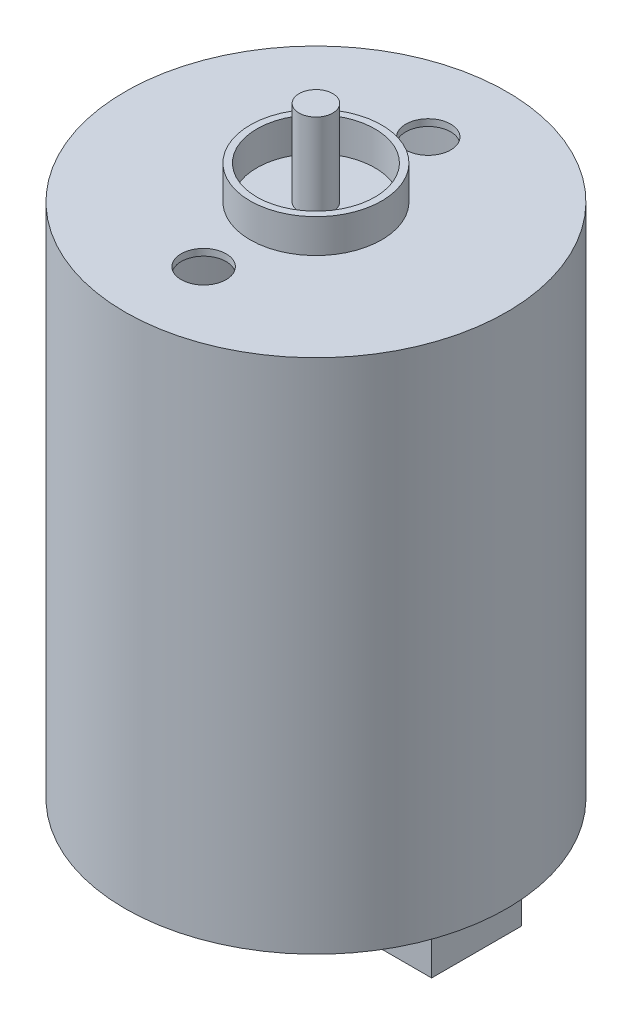
ISO-10303-21;
HEADER;
FILE_DESCRIPTION(('STEP AP214'),'2;1');
FILE_NAME('part.step','',(''),(''),'','','');
FILE_SCHEMA(('AUTOMOTIVE_DESIGN { 1 0 10303 214 1 1 1 1 }'));
ENDSEC;
DATA;
#1=APPLICATION_CONTEXT('core data for automotive mechanical design processes');
#2=APPLICATION_PROTOCOL_DEFINITION('international standard','automotive_design',2000,#1);
#3=PRODUCT_CONTEXT('',#1,'mechanical');
#4=PRODUCT('Part','Part','',(#3));
#5=PRODUCT_RELATED_PRODUCT_CATEGORY('part','',(#4));
#6=PRODUCT_DEFINITION_FORMATION('','',#4);
#7=PRODUCT_DEFINITION_CONTEXT('part definition',#1,'design');
#8=PRODUCT_DEFINITION('design','',#6,#7);
#9=PRODUCT_DEFINITION_SHAPE('','',#8);
#10=(LENGTH_UNIT() NAMED_UNIT(*) SI_UNIT(.MILLI.,.METRE.));
#11=(NAMED_UNIT(*) PLANE_ANGLE_UNIT() SI_UNIT($,.RADIAN.));
#12=(NAMED_UNIT(*) SI_UNIT($,.STERADIAN.) SOLID_ANGLE_UNIT());
#13=UNCERTAINTY_MEASURE_WITH_UNIT(LENGTH_MEASURE(1.E-05),#10,'distance_accuracy_value','');
#14=(GEOMETRIC_REPRESENTATION_CONTEXT(3) GLOBAL_UNCERTAINTY_ASSIGNED_CONTEXT((#13)) GLOBAL_UNIT_ASSIGNED_CONTEXT((#10,
#11,#12)) REPRESENTATION_CONTEXT('',''));
#15=CARTESIAN_POINT('',(0.,0.,0.));
#16=DIRECTION('',(0.,0.,1.));
#17=DIRECTION('',(1.,0.,0.));
#18=AXIS2_PLACEMENT_3D('',#15,#16,#17);
#19=CARTESIAN_POINT('',(0.,0.5,0.));
#20=DIRECTION('',(0.,-1.,0.));
#21=DIRECTION('',(0.,0.,-1.));
#22=AXIS2_PLACEMENT_3D('',#19,#20,#21);
#23=PLANE('',#22);
#24=CARTESIAN_POINT('',(0.,0.5,0.));
#25=DIRECTION('',(0.,-1.,0.));
#26=DIRECTION('',(0.,0.,-1.));
#27=AXIS2_PLACEMENT_3D('',#24,#25,#26);
#28=CIRCLE('',#27,1.15);
#29=CARTESIAN_POINT('',(0.,0.5,-1.15));
#30=VERTEX_POINT('',#29);
#31=EDGE_CURVE('E181',#30,#30,#28,.T.);
#32=ORIENTED_EDGE('',*,*,#31,.F.);
#33=EDGE_LOOP('',(#32));
#34=FACE_BOUND('',#33,.T.);
#35=CARTESIAN_POINT('',(0.,0.5,0.));
#36=DIRECTION('',(0.,-1.,0.));
#37=DIRECTION('',(0.,0.,-1.));
#38=AXIS2_PLACEMENT_3D('',#35,#36,#37);
#39=CIRCLE('',#38,8.2);
#40=CARTESIAN_POINT('',(0.,0.5,-8.2));
#41=VERTEX_POINT('',#40);
#42=EDGE_CURVE('E42',#41,#41,#39,.T.);
#43=ORIENTED_EDGE('',*,*,#42,.T.);
#44=EDGE_LOOP('',(#43));
#45=FACE_BOUND('',#44,.T.);
#46=DIRECTION('',(-1.,0.,0.));
#47=VECTOR('',#46,1.);
#48=CARTESIAN_POINT('',(-7.15,0.5,2.));
#49=LINE('',#48,#47);
#50=CARTESIAN_POINT('',(-4.85,0.5,2.));
#51=VERTEX_POINT('',#50);
#52=CARTESIAN_POINT('',(-7.15,0.5,2.));
#53=VERTEX_POINT('',#52);
#54=EDGE_CURVE('E128',#51,#53,#49,.T.);
#55=ORIENTED_EDGE('',*,*,#54,.F.);
#56=DIRECTION('',(0.,0.,1.));
#57=VECTOR('',#56,1.);
#58=CARTESIAN_POINT('',(-4.85,0.5,2.));
#59=LINE('',#58,#57);
#60=CARTESIAN_POINT('',(-4.85,0.5,-2.));
#61=VERTEX_POINT('',#60);
#62=EDGE_CURVE('E125',#61,#51,#59,.T.);
#63=ORIENTED_EDGE('',*,*,#62,.F.);
#64=DIRECTION('',(1.,0.,0.));
#65=VECTOR('',#64,1.);
#66=CARTESIAN_POINT('',(-7.15,0.5,-2.));
#67=LINE('',#66,#65);
#68=CARTESIAN_POINT('',(-7.15,0.5,-2.));
#69=VERTEX_POINT('',#68);
#70=EDGE_CURVE('E137',#69,#61,#67,.T.);
#71=ORIENTED_EDGE('',*,*,#70,.F.);
#72=DIRECTION('',(0.,0.,-1.));
#73=VECTOR('',#72,1.);
#74=CARTESIAN_POINT('',(-7.15,0.5,2.));
#75=LINE('',#74,#73);
#76=EDGE_CURVE('E145',#53,#69,#75,.T.);
#77=ORIENTED_EDGE('',*,*,#76,.F.);
#78=EDGE_LOOP('',(#55,#63,#71,#77));
#79=FACE_BOUND('',#78,.T.);
#80=DIRECTION('',(-1.,0.,0.));
#81=VECTOR('',#80,1.);
#82=CARTESIAN_POINT('',(4.85,0.5,2.));
#83=LINE('',#82,#81);
#84=CARTESIAN_POINT('',(7.15,0.5,2.));
#85=VERTEX_POINT('',#84);
#86=CARTESIAN_POINT('',(4.85,0.5,2.));
#87=VERTEX_POINT('',#86);
#88=EDGE_CURVE('E463',#85,#87,#83,.T.);
#89=ORIENTED_EDGE('',*,*,#88,.F.);
#90=DIRECTION('',(0.,0.,1.));
#91=VECTOR('',#90,1.);
#92=CARTESIAN_POINT('',(7.15,0.5,2.));
#93=LINE('',#92,#91);
#94=CARTESIAN_POINT('',(7.15,0.5,-2.));
#95=VERTEX_POINT('',#94);
#96=EDGE_CURVE('E123',#95,#85,#93,.T.);
#97=ORIENTED_EDGE('',*,*,#96,.F.);
#98=DIRECTION('',(1.,0.,0.));
#99=VECTOR('',#98,1.);
#100=CARTESIAN_POINT('',(4.85,0.5,-2.));
#101=LINE('',#100,#99);
#102=CARTESIAN_POINT('',(4.85,0.5,-2.));
#103=VERTEX_POINT('',#102);
#104=EDGE_CURVE('E119',#103,#95,#101,.T.);
#105=ORIENTED_EDGE('',*,*,#104,.F.);
#106=DIRECTION('',(0.,0.,-1.));
#107=VECTOR('',#106,1.);
#108=CARTESIAN_POINT('',(4.85,0.5,2.));
#109=LINE('',#108,#107);
#110=EDGE_CURVE('E460',#87,#103,#109,.T.);
#111=ORIENTED_EDGE('',*,*,#110,.F.);
#112=EDGE_LOOP('',(#89,#97,#105,#111));
#113=FACE_BOUND('',#112,.T.);
#114=ADVANCED_FACE('F34',(#34,#45,#79,#113),#23,.T.);
#115=CARTESIAN_POINT('',(0.,23.,0.));
#116=DIRECTION('',(0.,-1.,0.));
#117=DIRECTION('',(0.,0.,-1.));
#118=AXIS2_PLACEMENT_3D('',#115,#116,#117);
#119=CYLINDRICAL_SURFACE('',#118,8.5);
#120=CARTESIAN_POINT('',(0.,23.,0.));
#121=DIRECTION('',(0.,1.,0.));
#122=DIRECTION('',(0.,0.,1.));
#123=AXIS2_PLACEMENT_3D('',#120,#121,#122);
#124=CIRCLE('',#123,8.5);
#125=CARTESIAN_POINT('',(0.,23.,8.5));
#126=VERTEX_POINT('',#125);
#127=EDGE_CURVE('E199',#126,#126,#124,.T.);
#128=ORIENTED_EDGE('',*,*,#127,.F.);
#129=EDGE_LOOP('',(#128));
#130=FACE_BOUND('',#129,.T.);
#131=CARTESIAN_POINT('',(0.,0.,0.));
#132=DIRECTION('',(0.,1.,0.));
#133=DIRECTION('',(0.,0.,1.));
#134=AXIS2_PLACEMENT_3D('',#131,#132,#133);
#135=CIRCLE('',#134,8.5);
#136=CARTESIAN_POINT('',(0.,0.,8.5));
#137=VERTEX_POINT('',#136);
#138=EDGE_CURVE('E196',#137,#137,#135,.T.);
#139=ORIENTED_EDGE('',*,*,#138,.T.);
#140=EDGE_LOOP('',(#139));
#141=FACE_BOUND('',#140,.T.);
#142=ADVANCED_FACE('F36',(#130,#141),#119,.T.);
#143=CARTESIAN_POINT('',(0.,23.,0.));
#144=DIRECTION('',(0.,1.,0.));
#145=DIRECTION('',(0.,0.,1.));
#146=AXIS2_PLACEMENT_3D('',#143,#144,#145);
#147=PLANE('',#146);
#148=CARTESIAN_POINT('',(0.,23.,-5.));
#149=DIRECTION('',(0.,1.,0.));
#150=DIRECTION('',(0.,0.,1.));
#151=AXIS2_PLACEMENT_3D('',#148,#149,#150);
#152=CIRCLE('',#151,1.);
#153=CARTESIAN_POINT('',(0.,23.,-4.));
#154=VERTEX_POINT('',#153);
#155=EDGE_CURVE('E157',#154,#154,#152,.T.);
#156=ORIENTED_EDGE('',*,*,#155,.F.);
#157=EDGE_LOOP('',(#156));
#158=FACE_BOUND('',#157,.T.);
#159=CARTESIAN_POINT('',(0.,23.,5.));
#160=DIRECTION('',(0.,1.,0.));
#161=DIRECTION('',(0.,0.,1.));
#162=AXIS2_PLACEMENT_3D('',#159,#160,#161);
#163=CIRCLE('',#162,1.);
#164=CARTESIAN_POINT('',(0.,23.,6.));
#165=VERTEX_POINT('',#164);
#166=EDGE_CURVE('E156',#165,#165,#163,.T.);
#167=ORIENTED_EDGE('',*,*,#166,.F.);
#168=EDGE_LOOP('',(#167));
#169=FACE_BOUND('',#168,.T.);
#170=CARTESIAN_POINT('',(0.,23.,0.));
#171=DIRECTION('',(0.,1.,0.));
#172=DIRECTION('',(0.,0.,1.));
#173=AXIS2_PLACEMENT_3D('',#170,#171,#172);
#174=CIRCLE('',#173,2.92963960349153);
#175=CARTESIAN_POINT('',(0.,23.,2.92963960349153));
#176=VERTEX_POINT('',#175);
#177=EDGE_CURVE('E177',#176,#176,#174,.T.);
#178=ORIENTED_EDGE('',*,*,#177,.F.);
#179=EDGE_LOOP('',(#178));
#180=FACE_BOUND('',#179,.T.);
#181=ORIENTED_EDGE('',*,*,#127,.T.);
#182=EDGE_LOOP('',(#181));
#183=FACE_BOUND('',#182,.T.);
#184=ADVANCED_FACE('F219',(#158,#169,#180,#183),#147,.T.);
#185=CARTESIAN_POINT('',(0.,0.,0.));
#186=DIRECTION('',(0.,1.,0.));
#187=DIRECTION('',(0.,0.,1.));
#188=AXIS2_PLACEMENT_3D('',#185,#186,#187);
#189=PLANE('',#188);
#190=CARTESIAN_POINT('',(0.,0.,0.));
#191=DIRECTION('',(0.,1.,0.));
#192=DIRECTION('',(0.,0.,1.));
#193=AXIS2_PLACEMENT_3D('',#190,#191,#192);
#194=CIRCLE('',#193,8.2);
#195=CARTESIAN_POINT('',(0.,0.,8.2));
#196=VERTEX_POINT('',#195);
#197=EDGE_CURVE('E192',#196,#196,#194,.T.);
#198=ORIENTED_EDGE('',*,*,#197,.T.);
#199=EDGE_LOOP('',(#198));
#200=FACE_BOUND('',#199,.T.);
#201=ORIENTED_EDGE('',*,*,#138,.F.);
#202=EDGE_LOOP('',(#201));
#203=FACE_BOUND('',#202,.T.);
#204=ADVANCED_FACE('F212',(#200,#203),#189,.F.);
#205=CARTESIAN_POINT('',(0.,23.,0.));
#206=DIRECTION('',(0.,-1.,0.));
#207=DIRECTION('',(0.,0.,-1.));
#208=AXIS2_PLACEMENT_3D('',#205,#206,#207);
#209=CYLINDRICAL_SURFACE('',#208,8.2);
#210=ORIENTED_EDGE('',*,*,#42,.F.);
#211=EDGE_LOOP('',(#210));
#212=FACE_BOUND('',#211,.T.);
#213=ORIENTED_EDGE('',*,*,#197,.F.);
#214=EDGE_LOOP('',(#213));
#215=FACE_BOUND('',#214,.T.);
#216=ADVANCED_FACE('F208',(#212,#215),#209,.F.);
#217=CARTESIAN_POINT('',(0.,-1.,0.));
#218=DIRECTION('',(0.,1.,0.));
#219=DIRECTION('',(0.,0.,1.));
#220=AXIS2_PLACEMENT_3D('',#217,#218,#219);
#221=CYLINDRICAL_SURFACE('',#220,1.15);
#222=CARTESIAN_POINT('',(0.,-1.,0.));
#223=DIRECTION('',(0.,-1.,0.));
#224=DIRECTION('',(0.,0.,-1.));
#225=AXIS2_PLACEMENT_3D('',#222,#223,#224);
#226=CIRCLE('',#225,1.15);
#227=CARTESIAN_POINT('',(0.,-1.,-1.15));
#228=VERTEX_POINT('',#227);
#229=EDGE_CURVE('E184',#228,#228,#226,.T.);
#230=ORIENTED_EDGE('',*,*,#229,.F.);
#231=EDGE_LOOP('',(#230));
#232=FACE_BOUND('',#231,.T.);
#233=ORIENTED_EDGE('',*,*,#31,.T.);
#234=EDGE_LOOP('',(#233));
#235=FACE_BOUND('',#234,.T.);
#236=ADVANCED_FACE('F211',(#232,#235),#221,.T.);
#237=CARTESIAN_POINT('',(0.,-1.,0.));
#238=DIRECTION('',(0.,-1.,0.));
#239=DIRECTION('',(0.,0.,-1.));
#240=AXIS2_PLACEMENT_3D('',#237,#238,#239);
#241=PLANE('',#240);
#242=ORIENTED_EDGE('',*,*,#229,.T.);
#243=EDGE_LOOP('',(#242));
#244=FACE_BOUND('',#243,.T.);
#245=ADVANCED_FACE('F288',(#244),#241,.T.);
#246=CARTESIAN_POINT('',(0.,24.5,0.));
#247=DIRECTION('',(0.,1.,0.));
#248=DIRECTION('',(0.,0.,1.));
#249=AXIS2_PLACEMENT_3D('',#246,#247,#248);
#250=PLANE('',#249);
#251=CARTESIAN_POINT('',(0.,24.5,0.));
#252=DIRECTION('',(0.,1.,0.));
#253=DIRECTION('',(0.,0.,1.));
#254=AXIS2_PLACEMENT_3D('',#251,#252,#253);
#255=CIRCLE('',#254,2.92963960349153);
#256=CARTESIAN_POINT('',(0.,24.5,2.92963960349153));
#257=VERTEX_POINT('',#256);
#258=EDGE_CURVE('E178',#257,#257,#255,.T.);
#259=ORIENTED_EDGE('',*,*,#258,.T.);
#260=EDGE_LOOP('',(#259));
#261=FACE_BOUND('',#260,.T.);
#262=CARTESIAN_POINT('',(0.,24.5,0.));
#263=DIRECTION('',(0.,1.,0.));
#264=DIRECTION('',(0.,0.,1.));
#265=AXIS2_PLACEMENT_3D('',#262,#263,#264);
#266=CIRCLE('',#265,2.62963960349153);
#267=CARTESIAN_POINT('',(0.,24.5,2.62963960349153));
#268=VERTEX_POINT('',#267);
#269=EDGE_CURVE('E172',#268,#268,#266,.T.);
#270=ORIENTED_EDGE('',*,*,#269,.F.);
#271=EDGE_LOOP('',(#270));
#272=FACE_BOUND('',#271,.T.);
#273=ADVANCED_FACE('F285',(#261,#272),#250,.T.);
#274=CARTESIAN_POINT('',(0.,24.5,0.));
#275=DIRECTION('',(0.,-1.,0.));
#276=DIRECTION('',(0.,0.,-1.));
#277=AXIS2_PLACEMENT_3D('',#274,#275,#276);
#278=CYLINDRICAL_SURFACE('',#277,2.92963960349153);
#279=ORIENTED_EDGE('',*,*,#258,.F.);
#280=EDGE_LOOP('',(#279));
#281=FACE_BOUND('',#280,.T.);
#282=ORIENTED_EDGE('',*,*,#177,.T.);
#283=EDGE_LOOP('',(#282));
#284=FACE_BOUND('',#283,.T.);
#285=ADVANCED_FACE('F283',(#281,#284),#278,.T.);
#286=CARTESIAN_POINT('',(0.,24.5,0.));
#287=DIRECTION('',(0.,-1.,0.));
#288=DIRECTION('',(0.,0.,-1.));
#289=AXIS2_PLACEMENT_3D('',#286,#287,#288);
#290=CYLINDRICAL_SURFACE('',#289,2.62963960349153);
#291=ORIENTED_EDGE('',*,*,#269,.T.);
#292=EDGE_LOOP('',(#291));
#293=FACE_BOUND('',#292,.T.);
#294=CARTESIAN_POINT('',(0.,23.,0.));
#295=DIRECTION('',(0.,1.,0.));
#296=DIRECTION('',(0.,0.,1.));
#297=AXIS2_PLACEMENT_3D('',#294,#295,#296);
#298=CIRCLE('',#297,2.62963960349153);
#299=CARTESIAN_POINT('',(0.,23.,2.62963960349153));
#300=VERTEX_POINT('',#299);
#301=EDGE_CURVE('E11',#300,#300,#298,.F.);
#302=ORIENTED_EDGE('',*,*,#301,.T.);
#303=EDGE_LOOP('',(#302));
#304=FACE_BOUND('',#303,.T.);
#305=ADVANCED_FACE('F280',(#293,#304),#290,.F.);
#306=CARTESIAN_POINT('',(0.,23.,0.));
#307=DIRECTION('',(0.,1.,0.));
#308=DIRECTION('',(0.,0.,1.));
#309=AXIS2_PLACEMENT_3D('',#306,#307,#308);
#310=CIRCLE('',#309,0.75);
#311=CARTESIAN_POINT('',(0.,23.,-0.75));
#312=VERTEX_POINT('',#311);
#313=EDGE_CURVE('E164',#312,#312,#310,.T.);
#314=ORIENTED_EDGE('',*,*,#313,.F.);
#315=EDGE_LOOP('',(#314));
#316=FACE_BOUND('',#315,.T.);
#317=ORIENTED_EDGE('',*,*,#301,.F.);
#318=EDGE_LOOP('',(#317));
#319=FACE_BOUND('',#318,.T.);
#320=ADVANCED_FACE('F230',(#316,#319),#147,.T.);
#321=CARTESIAN_POINT('',(0.,26.8,0.));
#322=DIRECTION('',(0.,-1.,0.));
#323=DIRECTION('',(0.,0.,-1.));
#324=AXIS2_PLACEMENT_3D('',#321,#322,#323);
#325=CYLINDRICAL_SURFACE('',#324,0.75);
#326=CARTESIAN_POINT('',(0.,26.8,0.));
#327=DIRECTION('',(0.,1.,0.));
#328=DIRECTION('',(0.,0.,1.));
#329=AXIS2_PLACEMENT_3D('',#326,#327,#328);
#330=CIRCLE('',#329,0.75);
#331=CARTESIAN_POINT('',(0.,26.8,-0.75));
#332=VERTEX_POINT('',#331);
#333=EDGE_CURVE('E169',#332,#332,#330,.T.);
#334=CARTESIAN_POINT('',(0.,26.8,-0.75));
#335=CARTESIAN_POINT('',(0.,26.7604166666667,-0.75));
#336=CARTESIAN_POINT('',(0.,26.7208333333333,-0.75));
#337=CARTESIAN_POINT('',(0.,26.6416666666667,-0.75));
#338=CARTESIAN_POINT('',(0.,26.6020833333333,-0.75));
#339=CARTESIAN_POINT('',(0.,26.5229166666667,-0.75));
#340=CARTESIAN_POINT('',(0.,26.4833333333333,-0.75));
#341=CARTESIAN_POINT('',(0.,26.4041666666667,-0.75));
#342=CARTESIAN_POINT('',(0.,26.3645833333333,-0.75));
#343=CARTESIAN_POINT('',(0.,26.2854166666667,-0.75));
#344=CARTESIAN_POINT('',(0.,26.2458333333333,-0.75));
#345=CARTESIAN_POINT('',(0.,26.1666666666667,-0.75));
#346=CARTESIAN_POINT('',(0.,26.1270833333333,-0.75));
#347=CARTESIAN_POINT('',(0.,26.0479166666667,-0.75));
#348=CARTESIAN_POINT('',(0.,26.0083333333333,-0.75));
#349=CARTESIAN_POINT('',(0.,25.9291666666667,-0.75));
#350=CARTESIAN_POINT('',(0.,25.8895833333333,-0.75));
#351=CARTESIAN_POINT('',(0.,25.8104166666667,-0.75));
#352=CARTESIAN_POINT('',(0.,25.7708333333333,-0.75));
#353=CARTESIAN_POINT('',(0.,25.6916666666667,-0.75));
#354=CARTESIAN_POINT('',(0.,25.6520833333333,-0.75));
#355=CARTESIAN_POINT('',(0.,25.5729166666667,-0.75));
#356=CARTESIAN_POINT('',(0.,25.5333333333333,-0.75));
#357=CARTESIAN_POINT('',(0.,25.4541666666667,-0.75));
#358=CARTESIAN_POINT('',(0.,25.4145833333333,-0.75));
#359=CARTESIAN_POINT('',(0.,25.3354166666667,-0.75));
#360=CARTESIAN_POINT('',(0.,25.2958333333333,-0.75));
#361=CARTESIAN_POINT('',(0.,25.2166666666667,-0.75));
#362=CARTESIAN_POINT('',(0.,25.1770833333333,-0.75));
#363=CARTESIAN_POINT('',(0.,25.0979166666667,-0.75));
#364=CARTESIAN_POINT('',(0.,25.0583333333333,-0.75));
#365=CARTESIAN_POINT('',(0.,24.9791666666667,-0.75));
#366=CARTESIAN_POINT('',(0.,24.9395833333333,-0.75));
#367=CARTESIAN_POINT('',(0.,24.8604166666667,-0.75));
#368=CARTESIAN_POINT('',(0.,24.8208333333333,-0.75));
#369=CARTESIAN_POINT('',(0.,24.7416666666667,-0.75));
#370=CARTESIAN_POINT('',(0.,24.7020833333333,-0.75));
#371=CARTESIAN_POINT('',(0.,24.6229166666667,-0.75));
#372=CARTESIAN_POINT('',(0.,24.5833333333333,-0.75));
#373=CARTESIAN_POINT('',(0.,24.5041666666667,-0.75));
#374=CARTESIAN_POINT('',(0.,24.4645833333333,-0.75));
#375=CARTESIAN_POINT('',(0.,24.3854166666667,-0.75));
#376=CARTESIAN_POINT('',(0.,24.3458333333333,-0.75));
#377=CARTESIAN_POINT('',(0.,24.2666666666667,-0.75));
#378=CARTESIAN_POINT('',(0.,24.2270833333333,-0.75));
#379=CARTESIAN_POINT('',(0.,24.1479166666667,-0.75));
#380=CARTESIAN_POINT('',(0.,24.1083333333333,-0.75));
#381=CARTESIAN_POINT('',(0.,24.0291666666667,-0.75));
#382=CARTESIAN_POINT('',(0.,23.9895833333333,-0.75));
#383=CARTESIAN_POINT('',(0.,23.9104166666667,-0.75));
#384=CARTESIAN_POINT('',(0.,23.8708333333333,-0.75));
#385=CARTESIAN_POINT('',(0.,23.7916666666667,-0.75));
#386=CARTESIAN_POINT('',(0.,23.7520833333333,-0.75));
#387=CARTESIAN_POINT('',(0.,23.6729166666667,-0.75));
#388=CARTESIAN_POINT('',(0.,23.6333333333333,-0.75));
#389=CARTESIAN_POINT('',(0.,23.5541666666667,-0.75));
#390=CARTESIAN_POINT('',(0.,23.5145833333333,-0.75));
#391=CARTESIAN_POINT('',(0.,23.4354166666667,-0.75));
#392=CARTESIAN_POINT('',(0.,23.3958333333333,-0.75));
#393=CARTESIAN_POINT('',(0.,23.3166666666667,-0.75));
#394=CARTESIAN_POINT('',(0.,23.2770833333333,-0.75));
#395=CARTESIAN_POINT('',(0.,23.1979166666667,-0.75));
#396=CARTESIAN_POINT('',(0.,23.1583333333333,-0.75));
#397=CARTESIAN_POINT('',(0.,23.0791666666667,-0.75));
#398=CARTESIAN_POINT('',(0.,23.0395833333333,-0.75));
#399=CARTESIAN_POINT('',(0.,23.,-0.75));
#400=B_SPLINE_CURVE_WITH_KNOTS('',3,(#334,#335,#336,#337,#338,#339,#340,#341,#342,#343,#344,
#345,#346,#347,#348,#349,#350,#351,#352,#353,#354,#355,#356,#357,#358,#359,#360,#361,#362,#363,
#364,#365,#366,#367,#368,#369,#370,#371,#372,#373,#374,#375,#376,#377,#378,#379,#380,#381,#382,
#383,#384,#385,#386,#387,#388,#389,#390,#391,#392,#393,#394,#395,#396,#397,#398,#399),
.UNSPECIFIED.,.F.,.F.,(4,2,2,2,2,2,2,2,2,2,2,2,2,2,2,2,2,2,2,2,2,2,2,2,2,2,2,2,2,2,2,2,4),(0.,
0.118750000000001,0.237500000000002,0.356250000000002,0.475000000000003,0.593750000000001,
0.712500000000001,0.831250000000002,0.950000000000003,1.06875,1.1875,1.30625,1.425,1.54375,
1.6625,1.78125,1.9,2.01875,2.1375,2.25625,2.375,2.49375,2.6125,2.73125,2.85,2.96875,3.0875,
3.20625,3.32500000000001,3.44375,3.5625,3.68125,3.8),.UNSPECIFIED.);
#401=EDGE_CURVE('BSEAM272',#332,#312,#400,.T.);
#402=ORIENTED_EDGE('',*,*,#333,.F.);
#403=ORIENTED_EDGE('',*,*,#313,.T.);
#404=ORIENTED_EDGE('',*,*,#401,.T.);
#405=ORIENTED_EDGE('',*,*,#401,.F.);
#406=EDGE_LOOP('',(#402,#404,#403,#405));
#407=FACE_BOUND('',#406,.T.);
#408=ADVANCED_FACE('F272',(#407),#325,.T.);
#409=CARTESIAN_POINT('',(0.,26.8,0.));
#410=DIRECTION('',(0.,1.,0.));
#411=DIRECTION('',(0.,0.,1.));
#412=AXIS2_PLACEMENT_3D('',#409,#410,#411);
#413=PLANE('',#412);
#414=ORIENTED_EDGE('',*,*,#333,.T.);
#415=EDGE_LOOP('',(#414));
#416=FACE_BOUND('',#415,.T.);
#417=ADVANCED_FACE('F263',(#416),#413,.T.);
#418=CARTESIAN_POINT('',(0.,-1.001,5.));
#419=DIRECTION('',(0.,1.,0.));
#420=DIRECTION('',(0.,0.,1.));
#421=AXIS2_PLACEMENT_3D('',#418,#419,#420);
#422=CYLINDRICAL_SURFACE('',#421,1.);
#423=ORIENTED_EDGE('',*,*,#166,.T.);
#424=EDGE_LOOP('',(#423));
#425=FACE_BOUND('',#424,.T.);
#426=CARTESIAN_POINT('',(0.,22.7,5.));
#427=DIRECTION('',(0.,1.,0.));
#428=DIRECTION('',(0.,0.,1.));
#429=AXIS2_PLACEMENT_3D('',#426,#427,#428);
#430=CIRCLE('',#429,1.);
#431=CARTESIAN_POINT('',(0.,22.7,6.));
#432=VERTEX_POINT('',#431);
#433=EDGE_CURVE('E161',#432,#432,#430,.F.);
#434=ORIENTED_EDGE('',*,*,#433,.T.);
#435=EDGE_LOOP('',(#434));
#436=FACE_BOUND('',#435,.T.);
#437=ADVANCED_FACE('F261',(#425,#436),#422,.F.);
#438=CARTESIAN_POINT('',(0.,-1.001,-5.));
#439=DIRECTION('',(0.,1.,0.));
#440=DIRECTION('',(0.,0.,1.));
#441=AXIS2_PLACEMENT_3D('',#438,#439,#440);
#442=CYLINDRICAL_SURFACE('',#441,1.);
#443=ORIENTED_EDGE('',*,*,#155,.T.);
#444=EDGE_LOOP('',(#443));
#445=FACE_BOUND('',#444,.T.);
#446=CARTESIAN_POINT('',(0.,22.7,-5.));
#447=DIRECTION('',(0.,1.,0.));
#448=DIRECTION('',(0.,0.,1.));
#449=AXIS2_PLACEMENT_3D('',#446,#447,#448);
#450=CIRCLE('',#449,1.);
#451=CARTESIAN_POINT('',(0.,22.7,-4.));
#452=VERTEX_POINT('',#451);
#453=EDGE_CURVE('E160',#452,#452,#450,.F.);
#454=ORIENTED_EDGE('',*,*,#453,.T.);
#455=EDGE_LOOP('',(#454));
#456=FACE_BOUND('',#455,.T.);
#457=ADVANCED_FACE('F251',(#445,#456),#442,.F.);
#458=CARTESIAN_POINT('',(0.,0.8,0.));
#459=DIRECTION('',(0.,-1.,0.));
#460=DIRECTION('',(0.,0.,-1.));
#461=AXIS2_PLACEMENT_3D('',#458,#459,#460);
#462=PLANE('',#461);
#463=CARTESIAN_POINT('',(0.,0.8,0.));
#464=DIRECTION('',(0.,-1.,0.));
#465=DIRECTION('',(0.,0.,-1.));
#466=AXIS2_PLACEMENT_3D('',#463,#464,#465);
#467=CIRCLE('',#466,8.2);
#468=CARTESIAN_POINT('',(0.,0.8,-8.2));
#469=VERTEX_POINT('',#468);
#470=EDGE_CURVE('E187',#469,#469,#467,.T.);
#471=ORIENTED_EDGE('',*,*,#470,.F.);
#472=EDGE_LOOP('',(#471));
#473=FACE_BOUND('',#472,.T.);
#474=ADVANCED_FACE('F239',(#473),#462,.F.);
#475=CARTESIAN_POINT('',(0.,22.7,0.));
#476=DIRECTION('',(0.,1.,0.));
#477=DIRECTION('',(0.,0.,1.));
#478=AXIS2_PLACEMENT_3D('',#475,#476,#477);
#479=PLANE('',#478);
#480=ORIENTED_EDGE('',*,*,#453,.F.);
#481=EDGE_LOOP('',(#480));
#482=FACE_BOUND('',#481,.T.);
#483=ORIENTED_EDGE('',*,*,#433,.F.);
#484=EDGE_LOOP('',(#483));
#485=FACE_BOUND('',#484,.T.);
#486=CARTESIAN_POINT('',(0.,22.7,0.));
#487=DIRECTION('',(0.,1.,0.));
#488=DIRECTION('',(0.,0.,1.));
#489=AXIS2_PLACEMENT_3D('',#486,#487,#488);
#490=CIRCLE('',#489,8.2);
#491=CARTESIAN_POINT('',(0.,22.7,8.2));
#492=VERTEX_POINT('',#491);
#493=EDGE_CURVE('E193',#492,#492,#490,.T.);
#494=ORIENTED_EDGE('',*,*,#493,.F.);
#495=EDGE_LOOP('',(#494));
#496=FACE_BOUND('',#495,.T.);
#497=ADVANCED_FACE('F242',(#482,#485,#496),#479,.F.);
#498=ORIENTED_EDGE('',*,*,#493,.T.);
#499=EDGE_LOOP('',(#498));
#500=FACE_BOUND('',#499,.T.);
#501=ORIENTED_EDGE('',*,*,#470,.T.);
#502=EDGE_LOOP('',(#501));
#503=FACE_BOUND('',#502,.T.);
#504=ADVANCED_FACE('F214',(#500,#503),#209,.F.);
#505=CARTESIAN_POINT('',(-4.85,-2.35,2.));
#506=DIRECTION('',(-1.,0.,0.));
#507=DIRECTION('',(0.,0.,1.));
#508=AXIS2_PLACEMENT_3D('',#505,#506,#507);
#509=PLANE('',#508);
#510=ORIENTED_EDGE('',*,*,#62,.T.);
#511=DIRECTION('',(0.,1.,0.));
#512=VECTOR('',#511,1.);
#513=CARTESIAN_POINT('',(-4.85,-2.35,2.));
#514=LINE('',#513,#512);
#515=CARTESIAN_POINT('',(-4.85,-2.35,2.));
#516=VERTEX_POINT('',#515);
#517=EDGE_CURVE('E154',#516,#51,#514,.T.);
#518=ORIENTED_EDGE('',*,*,#517,.F.);
#519=DIRECTION('',(0.,0.,1.));
#520=VECTOR('',#519,1.);
#521=CARTESIAN_POINT('',(-4.85,-2.35,2.));
#522=LINE('',#521,#520);
#523=CARTESIAN_POINT('',(-4.85,-2.35,-2.));
#524=VERTEX_POINT('',#523);
#525=EDGE_CURVE('E133',#524,#516,#522,.T.);
#526=ORIENTED_EDGE('',*,*,#525,.F.);
#527=DIRECTION('',(0.,1.,0.));
#528=VECTOR('',#527,1.);
#529=CARTESIAN_POINT('',(-4.85,-2.35,-2.));
#530=LINE('',#529,#528);
#531=EDGE_CURVE('E142',#524,#61,#530,.T.);
#532=ORIENTED_EDGE('',*,*,#531,.T.);
#533=EDGE_LOOP('',(#510,#518,#526,#532));
#534=FACE_BOUND('',#533,.T.);
#535=ADVANCED_FACE('F249',(#534),#509,.F.);
#536=CARTESIAN_POINT('',(-7.15,-2.35,2.));
#537=DIRECTION('',(0.,0.,-1.));
#538=DIRECTION('',(-1.,0.,0.));
#539=AXIS2_PLACEMENT_3D('',#536,#537,#538);
#540=PLANE('',#539);
#541=ORIENTED_EDGE('',*,*,#54,.T.);
#542=DIRECTION('',(0.,1.,0.));
#543=VECTOR('',#542,1.);
#544=CARTESIAN_POINT('',(-7.15,-2.35,2.));
#545=LINE('',#544,#543);
#546=CARTESIAN_POINT('',(-7.15,-2.35,2.));
#547=VERTEX_POINT('',#546);
#548=EDGE_CURVE('E151',#547,#53,#545,.T.);
#549=ORIENTED_EDGE('',*,*,#548,.F.);
#550=DIRECTION('',(-1.,0.,0.));
#551=VECTOR('',#550,1.);
#552=CARTESIAN_POINT('',(-7.15,-2.35,2.));
#553=LINE('',#552,#551);
#554=EDGE_CURVE('E136',#516,#547,#553,.T.);
#555=ORIENTED_EDGE('',*,*,#554,.F.);
#556=ORIENTED_EDGE('',*,*,#517,.T.);
#557=EDGE_LOOP('',(#541,#549,#555,#556));
#558=FACE_BOUND('',#557,.T.);
#559=ADVANCED_FACE('F371',(#558),#540,.F.);
#560=CARTESIAN_POINT('',(-7.15,-2.35,2.));
#561=DIRECTION('',(1.,0.,0.));
#562=DIRECTION('',(0.,0.,-1.));
#563=AXIS2_PLACEMENT_3D('',#560,#561,#562);
#564=PLANE('',#563);
#565=ORIENTED_EDGE('',*,*,#76,.T.);
#566=DIRECTION('',(0.,1.,0.));
#567=VECTOR('',#566,1.);
#568=CARTESIAN_POINT('',(-7.15,-2.35,-2.));
#569=LINE('',#568,#567);
#570=CARTESIAN_POINT('',(-7.15,-2.35,-2.));
#571=VERTEX_POINT('',#570);
#572=EDGE_CURVE('E57',#571,#69,#569,.T.);
#573=ORIENTED_EDGE('',*,*,#572,.F.);
#574=DIRECTION('',(0.,0.,-1.));
#575=VECTOR('',#574,1.);
#576=CARTESIAN_POINT('',(-7.15,-2.35,2.));
#577=LINE('',#576,#575);
#578=EDGE_CURVE('E139',#547,#571,#577,.T.);
#579=ORIENTED_EDGE('',*,*,#578,.F.);
#580=ORIENTED_EDGE('',*,*,#548,.T.);
#581=EDGE_LOOP('',(#565,#573,#579,#580));
#582=FACE_BOUND('',#581,.T.);
#583=ADVANCED_FACE('F380',(#582),#564,.F.);
#584=CARTESIAN_POINT('',(-7.15,-2.35,-2.));
#585=DIRECTION('',(0.,0.,1.));
#586=DIRECTION('',(1.,0.,0.));
#587=AXIS2_PLACEMENT_3D('',#584,#585,#586);
#588=PLANE('',#587);
#589=ORIENTED_EDGE('',*,*,#70,.T.);
#590=ORIENTED_EDGE('',*,*,#531,.F.);
#591=DIRECTION('',(1.,0.,0.));
#592=VECTOR('',#591,1.);
#593=CARTESIAN_POINT('',(-7.15,-2.35,-2.));
#594=LINE('',#593,#592);
#595=EDGE_CURVE('E141',#571,#524,#594,.T.);
#596=ORIENTED_EDGE('',*,*,#595,.F.);
#597=ORIENTED_EDGE('',*,*,#572,.T.);
#598=EDGE_LOOP('',(#589,#590,#596,#597));
#599=FACE_BOUND('',#598,.T.);
#600=ADVANCED_FACE('F390',(#599),#588,.F.);
#601=CARTESIAN_POINT('',(0.,-2.35,0.));
#602=DIRECTION('',(0.,-1.,0.));
#603=DIRECTION('',(0.,0.,-1.));
#604=AXIS2_PLACEMENT_3D('',#601,#602,#603);
#605=PLANE('',#604);
#606=ORIENTED_EDGE('',*,*,#525,.T.);
#607=ORIENTED_EDGE('',*,*,#554,.T.);
#608=ORIENTED_EDGE('',*,*,#578,.T.);
#609=ORIENTED_EDGE('',*,*,#595,.T.);
#610=EDGE_LOOP('',(#606,#607,#608,#609));
#611=FACE_BOUND('',#610,.T.);
#612=ADVANCED_FACE('F400',(#611),#605,.T.);
#613=CARTESIAN_POINT('',(7.15,-2.35,2.));
#614=DIRECTION('',(-1.,0.,0.));
#615=DIRECTION('',(0.,0.,1.));
#616=AXIS2_PLACEMENT_3D('',#613,#614,#615);
#617=PLANE('',#616);
#618=ORIENTED_EDGE('',*,*,#96,.T.);
#619=DIRECTION('',(0.,1.,0.));
#620=VECTOR('',#619,1.);
#621=CARTESIAN_POINT('',(7.15,-2.35,2.));
#622=LINE('',#621,#620);
#623=CARTESIAN_POINT('',(7.15,-2.35,2.));
#624=VERTEX_POINT('',#623);
#625=EDGE_CURVE('E104',#624,#85,#622,.T.);
#626=ORIENTED_EDGE('',*,*,#625,.F.);
#627=DIRECTION('',(0.,0.,1.));
#628=VECTOR('',#627,1.);
#629=CARTESIAN_POINT('',(7.15,-2.35,2.));
#630=LINE('',#629,#628);
#631=CARTESIAN_POINT('',(7.15,-2.35,-2.));
#632=VERTEX_POINT('',#631);
#633=EDGE_CURVE('E111',#632,#624,#630,.T.);
#634=ORIENTED_EDGE('',*,*,#633,.F.);
#635=DIRECTION('',(0.,1.,0.));
#636=VECTOR('',#635,1.);
#637=CARTESIAN_POINT('',(7.15,-2.35,-2.));
#638=LINE('',#637,#636);
#639=EDGE_CURVE('E457',#632,#95,#638,.T.);
#640=ORIENTED_EDGE('',*,*,#639,.T.);
#641=EDGE_LOOP('',(#618,#626,#634,#640));
#642=FACE_BOUND('',#641,.T.);
#643=ADVANCED_FACE('F121',(#642),#617,.F.);
#644=CARTESIAN_POINT('',(4.85,-2.35,2.));
#645=DIRECTION('',(0.,0.,-1.));
#646=DIRECTION('',(-1.,0.,0.));
#647=AXIS2_PLACEMENT_3D('',#644,#645,#646);
#648=PLANE('',#647);
#649=ORIENTED_EDGE('',*,*,#88,.T.);
#650=DIRECTION('',(0.,1.,0.));
#651=VECTOR('',#650,1.);
#652=CARTESIAN_POINT('',(4.85,-2.35,2.));
#653=LINE('',#652,#651);
#654=CARTESIAN_POINT('',(4.85,-2.35,2.));
#655=VERTEX_POINT('',#654);
#656=EDGE_CURVE('E107',#655,#87,#653,.T.);
#657=ORIENTED_EDGE('',*,*,#656,.F.);
#658=DIRECTION('',(-1.,0.,0.));
#659=VECTOR('',#658,1.);
#660=CARTESIAN_POINT('',(4.85,-2.35,2.));
#661=LINE('',#660,#659);
#662=EDGE_CURVE('E100',#624,#655,#661,.T.);
#663=ORIENTED_EDGE('',*,*,#662,.F.);
#664=ORIENTED_EDGE('',*,*,#625,.T.);
#665=EDGE_LOOP('',(#649,#657,#663,#664));
#666=FACE_BOUND('',#665,.T.);
#667=ADVANCED_FACE('F102',(#666),#648,.F.);
#668=CARTESIAN_POINT('',(4.85,-2.35,2.));
#669=DIRECTION('',(1.,0.,0.));
#670=DIRECTION('',(0.,0.,-1.));
#671=AXIS2_PLACEMENT_3D('',#668,#669,#670);
#672=PLANE('',#671);
#673=ORIENTED_EDGE('',*,*,#110,.T.);
#674=DIRECTION('',(0.,1.,0.));
#675=VECTOR('',#674,1.);
#676=CARTESIAN_POINT('',(4.85,-2.35,-2.));
#677=LINE('',#676,#675);
#678=CARTESIAN_POINT('',(4.85,-2.35,-2.));
#679=VERTEX_POINT('',#678);
#680=EDGE_CURVE('E49',#679,#103,#677,.T.);
#681=ORIENTED_EDGE('',*,*,#680,.F.);
#682=DIRECTION('',(0.,0.,-1.));
#683=VECTOR('',#682,1.);
#684=CARTESIAN_POINT('',(4.85,-2.35,2.));
#685=LINE('',#684,#683);
#686=EDGE_CURVE('E110',#655,#679,#685,.T.);
#687=ORIENTED_EDGE('',*,*,#686,.F.);
#688=ORIENTED_EDGE('',*,*,#656,.T.);
#689=EDGE_LOOP('',(#673,#681,#687,#688));
#690=FACE_BOUND('',#689,.T.);
#691=ADVANCED_FACE('F426',(#690),#672,.F.);
#692=CARTESIAN_POINT('',(4.85,-2.35,-2.));
#693=DIRECTION('',(0.,0.,1.));
#694=DIRECTION('',(1.,0.,0.));
#695=AXIS2_PLACEMENT_3D('',#692,#693,#694);
#696=PLANE('',#695);
#697=ORIENTED_EDGE('',*,*,#104,.T.);
#698=ORIENTED_EDGE('',*,*,#639,.F.);
#699=DIRECTION('',(1.,0.,0.));
#700=VECTOR('',#699,1.);
#701=CARTESIAN_POINT('',(4.85,-2.35,-2.));
#702=LINE('',#701,#700);
#703=EDGE_CURVE('E115',#679,#632,#702,.T.);
#704=ORIENTED_EDGE('',*,*,#703,.F.);
#705=ORIENTED_EDGE('',*,*,#680,.T.);
#706=EDGE_LOOP('',(#697,#698,#704,#705));
#707=FACE_BOUND('',#706,.T.);
#708=ADVANCED_FACE('F435',(#707),#696,.F.);
#709=CARTESIAN_POINT('',(0.,-2.35,0.));
#710=DIRECTION('',(0.,-1.,0.));
#711=DIRECTION('',(0.,0.,-1.));
#712=AXIS2_PLACEMENT_3D('',#709,#710,#711);
#713=PLANE('',#712);
#714=ORIENTED_EDGE('',*,*,#633,.T.);
#715=ORIENTED_EDGE('',*,*,#662,.T.);
#716=ORIENTED_EDGE('',*,*,#686,.T.);
#717=ORIENTED_EDGE('',*,*,#703,.T.);
#718=EDGE_LOOP('',(#714,#715,#716,#717));
#719=FACE_BOUND('',#718,.T.);
#720=ADVANCED_FACE('F114',(#719),#713,.T.);
#721=CLOSED_SHELL('',(#114,#142,#184,#204,#216,#236,#245,#273,#285,#305,#320,#408,#417,#437,
#457,#474,#497,#504,#535,#559,#583,#600,#612,#643,#667,#691,#708,#720));
#722=MANIFOLD_SOLID_BREP('B2',#721);
#723=ADVANCED_BREP_SHAPE_REPRESENTATION('',(#18,#722),#14);
#724=SHAPE_DEFINITION_REPRESENTATION(#9,#723);
ENDSEC;
END-ISO-10303-21;
